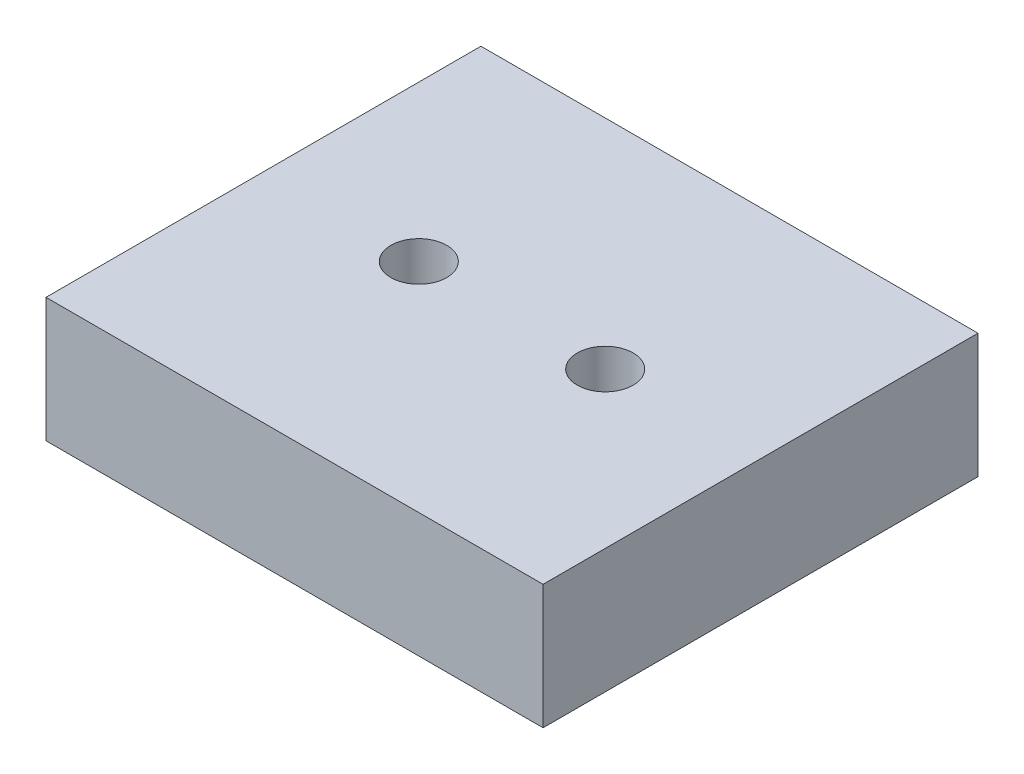
ISO-10303-21;
HEADER;
FILE_DESCRIPTION(('STEP AP214'),'2;1');
FILE_NAME('part.step','',(''),(''),'','','');
FILE_SCHEMA(('AUTOMOTIVE_DESIGN { 1 0 10303 214 1 1 1 1 }'));
ENDSEC;
DATA;
#1=APPLICATION_CONTEXT('core data for automotive mechanical design processes');
#2=APPLICATION_PROTOCOL_DEFINITION('international standard','automotive_design',2000,#1);
#3=PRODUCT_CONTEXT('',#1,'mechanical');
#4=PRODUCT('Part','Part','',(#3));
#5=PRODUCT_RELATED_PRODUCT_CATEGORY('part','',(#4));
#6=PRODUCT_DEFINITION_FORMATION('','',#4);
#7=PRODUCT_DEFINITION_CONTEXT('part definition',#1,'design');
#8=PRODUCT_DEFINITION('design','',#6,#7);
#9=PRODUCT_DEFINITION_SHAPE('','',#8);
#10=(LENGTH_UNIT() NAMED_UNIT(*) SI_UNIT(.MILLI.,.METRE.));
#11=(NAMED_UNIT(*) PLANE_ANGLE_UNIT() SI_UNIT($,.RADIAN.));
#12=(NAMED_UNIT(*) SI_UNIT($,.STERADIAN.) SOLID_ANGLE_UNIT());
#13=UNCERTAINTY_MEASURE_WITH_UNIT(LENGTH_MEASURE(1.E-05),#10,'distance_accuracy_value','');
#14=(GEOMETRIC_REPRESENTATION_CONTEXT(3) GLOBAL_UNCERTAINTY_ASSIGNED_CONTEXT((#13)) GLOBAL_UNIT_ASSIGNED_CONTEXT((#10,
#11,#12)) REPRESENTATION_CONTEXT('',''));
#15=CARTESIAN_POINT('',(0.,0.,0.));
#16=DIRECTION('',(0.,0.,1.));
#17=DIRECTION('',(1.,0.,0.));
#18=AXIS2_PLACEMENT_3D('',#15,#16,#17);
#19=CARTESIAN_POINT('',(20.,10.,-17.5));
#20=DIRECTION('',(-1.,0.,0.));
#21=DIRECTION('',(0.,0.,1.));
#22=AXIS2_PLACEMENT_3D('',#19,#20,#21);
#23=PLANE('',#22);
#24=DIRECTION('',(0.,0.,-1.));
#25=VECTOR('',#24,1.);
#26=CARTESIAN_POINT('',(20.,0.,-17.5));
#27=LINE('',#26,#25);
#28=CARTESIAN_POINT('',(20.,0.,17.5));
#29=VERTEX_POINT('',#28);
#30=CARTESIAN_POINT('',(20.,0.,-17.5));
#31=VERTEX_POINT('',#30);
#32=EDGE_CURVE('E155',#29,#31,#27,.T.);
#33=ORIENTED_EDGE('',*,*,#32,.T.);
#34=DIRECTION('',(0.,-1.,0.));
#35=VECTOR('',#34,1.);
#36=CARTESIAN_POINT('',(20.,10.,-17.5));
#37=LINE('',#36,#35);
#38=CARTESIAN_POINT('',(20.,10.,-17.5));
#39=VERTEX_POINT('',#38);
#40=EDGE_CURVE('E12',#39,#31,#37,.T.);
#41=ORIENTED_EDGE('',*,*,#40,.F.);
#42=DIRECTION('',(0.,0.,-1.));
#43=VECTOR('',#42,1.);
#44=CARTESIAN_POINT('',(20.,10.,-17.5));
#45=LINE('',#44,#43);
#46=CARTESIAN_POINT('',(20.,10.,17.5));
#47=VERTEX_POINT('',#46);
#48=EDGE_CURVE('E138',#47,#39,#45,.T.);
#49=ORIENTED_EDGE('',*,*,#48,.F.);
#50=DIRECTION('',(0.,-1.,0.));
#51=VECTOR('',#50,1.);
#52=CARTESIAN_POINT('',(20.,10.,17.5));
#53=LINE('',#52,#51);
#54=EDGE_CURVE('E146',#47,#29,#53,.T.);
#55=ORIENTED_EDGE('',*,*,#54,.T.);
#56=EDGE_LOOP('',(#33,#41,#49,#55));
#57=FACE_BOUND('',#56,.T.);
#58=ADVANCED_FACE('F90',(#57),#23,.F.);
#59=CARTESIAN_POINT('',(-20.,10.,-17.5));
#60=DIRECTION('',(0.,0.,1.));
#61=DIRECTION('',(1.,0.,0.));
#62=AXIS2_PLACEMENT_3D('',#59,#60,#61);
#63=PLANE('',#62);
#64=DIRECTION('',(-1.,0.,0.));
#65=VECTOR('',#64,1.);
#66=CARTESIAN_POINT('',(-20.,0.,-17.5));
#67=LINE('',#66,#65);
#68=CARTESIAN_POINT('',(-20.,0.,-17.5));
#69=VERTEX_POINT('',#68);
#70=EDGE_CURVE('E145',#31,#69,#67,.T.);
#71=ORIENTED_EDGE('',*,*,#70,.T.);
#72=DIRECTION('',(0.,-1.,0.));
#73=VECTOR('',#72,1.);
#74=CARTESIAN_POINT('',(-20.,10.,-17.5));
#75=LINE('',#74,#73);
#76=CARTESIAN_POINT('',(-20.,10.,-17.5));
#77=VERTEX_POINT('',#76);
#78=EDGE_CURVE('E100',#77,#69,#75,.T.);
#79=ORIENTED_EDGE('',*,*,#78,.F.);
#80=DIRECTION('',(-1.,0.,0.));
#81=VECTOR('',#80,1.);
#82=CARTESIAN_POINT('',(-20.,10.,-17.5));
#83=LINE('',#82,#81);
#84=EDGE_CURVE('E133',#39,#77,#83,.T.);
#85=ORIENTED_EDGE('',*,*,#84,.F.);
#86=ORIENTED_EDGE('',*,*,#40,.T.);
#87=EDGE_LOOP('',(#71,#79,#85,#86));
#88=FACE_BOUND('',#87,.T.);
#89=ADVANCED_FACE('F141',(#88),#63,.F.);
#90=CARTESIAN_POINT('',(-20.,10.,-17.5));
#91=DIRECTION('',(1.,0.,0.));
#92=DIRECTION('',(0.,0.,-1.));
#93=AXIS2_PLACEMENT_3D('',#90,#91,#92);
#94=PLANE('',#93);
#95=DIRECTION('',(0.,0.,1.));
#96=VECTOR('',#95,1.);
#97=CARTESIAN_POINT('',(-20.,0.,-17.5));
#98=LINE('',#97,#96);
#99=CARTESIAN_POINT('',(-20.,0.,17.5));
#100=VERTEX_POINT('',#99);
#101=EDGE_CURVE('E125',#69,#100,#98,.T.);
#102=ORIENTED_EDGE('',*,*,#101,.T.);
#103=DIRECTION('',(0.,-1.,0.));
#104=VECTOR('',#103,1.);
#105=CARTESIAN_POINT('',(-20.,10.,17.5));
#106=LINE('',#105,#104);
#107=CARTESIAN_POINT('',(-20.,10.,17.5));
#108=VERTEX_POINT('',#107);
#109=EDGE_CURVE('E144',#108,#100,#106,.T.);
#110=ORIENTED_EDGE('',*,*,#109,.F.);
#111=DIRECTION('',(0.,0.,1.));
#112=VECTOR('',#111,1.);
#113=CARTESIAN_POINT('',(-20.,10.,-17.5));
#114=LINE('',#113,#112);
#115=EDGE_CURVE('E139',#77,#108,#114,.T.);
#116=ORIENTED_EDGE('',*,*,#115,.F.);
#117=ORIENTED_EDGE('',*,*,#78,.T.);
#118=EDGE_LOOP('',(#102,#110,#116,#117));
#119=FACE_BOUND('',#118,.T.);
#120=ADVANCED_FACE('F148',(#119),#94,.F.);
#121=CARTESIAN_POINT('',(-20.,10.,17.5));
#122=DIRECTION('',(0.,0.,-1.));
#123=DIRECTION('',(-1.,0.,0.));
#124=AXIS2_PLACEMENT_3D('',#121,#122,#123);
#125=PLANE('',#124);
#126=DIRECTION('',(1.,0.,0.));
#127=VECTOR('',#126,1.);
#128=CARTESIAN_POINT('',(-20.,0.,17.5));
#129=LINE('',#128,#127);
#130=EDGE_CURVE('E126',#100,#29,#129,.T.);
#131=ORIENTED_EDGE('',*,*,#130,.T.);
#132=ORIENTED_EDGE('',*,*,#54,.F.);
#133=DIRECTION('',(1.,0.,0.));
#134=VECTOR('',#133,1.);
#135=CARTESIAN_POINT('',(-20.,10.,17.5));
#136=LINE('',#135,#134);
#137=EDGE_CURVE('E104',#108,#47,#136,.T.);
#138=ORIENTED_EDGE('',*,*,#137,.F.);
#139=ORIENTED_EDGE('',*,*,#109,.T.);
#140=EDGE_LOOP('',(#131,#132,#138,#139));
#141=FACE_BOUND('',#140,.T.);
#142=ADVANCED_FACE('F159',(#141),#125,.F.);
#143=CARTESIAN_POINT('',(0.,10.,0.));
#144=DIRECTION('',(0.,1.,0.));
#145=DIRECTION('',(0.,0.,1.));
#146=AXIS2_PLACEMENT_3D('',#143,#144,#145);
#147=PLANE('',#146);
#148=CARTESIAN_POINT('',(-7.5,10.,0.));
#149=DIRECTION('',(0.,1.,0.));
#150=DIRECTION('',(0.,0.,1.));
#151=AXIS2_PLACEMENT_3D('',#148,#149,#150);
#152=CIRCLE('',#151,2.25);
#153=CARTESIAN_POINT('',(-7.5,10.,2.25));
#154=VERTEX_POINT('',#153);
#155=EDGE_CURVE('E154',#154,#154,#152,.T.);
#156=ORIENTED_EDGE('',*,*,#155,.F.);
#157=EDGE_LOOP('',(#156));
#158=FACE_BOUND('',#157,.T.);
#159=CARTESIAN_POINT('',(7.5,10.,0.));
#160=DIRECTION('',(0.,1.,0.));
#161=DIRECTION('',(0.,0.,1.));
#162=AXIS2_PLACEMENT_3D('',#159,#160,#161);
#163=CIRCLE('',#162,2.25);
#164=CARTESIAN_POINT('',(7.5,10.,2.25));
#165=VERTEX_POINT('',#164);
#166=EDGE_CURVE('E166',#165,#165,#163,.T.);
#167=ORIENTED_EDGE('',*,*,#166,.F.);
#168=EDGE_LOOP('',(#167));
#169=FACE_BOUND('',#168,.T.);
#170=ORIENTED_EDGE('',*,*,#48,.T.);
#171=ORIENTED_EDGE('',*,*,#84,.T.);
#172=ORIENTED_EDGE('',*,*,#115,.T.);
#173=ORIENTED_EDGE('',*,*,#137,.T.);
#174=EDGE_LOOP('',(#170,#171,#172,#173));
#175=FACE_BOUND('',#174,.T.);
#176=ADVANCED_FACE('F137',(#158,#169,#175),#147,.T.);
#177=CARTESIAN_POINT('',(0.,0.,0.));
#178=DIRECTION('',(0.,1.,0.));
#179=DIRECTION('',(0.,0.,1.));
#180=AXIS2_PLACEMENT_3D('',#177,#178,#179);
#181=PLANE('',#180);
#182=CARTESIAN_POINT('',(-7.5,0.,0.));
#183=DIRECTION('',(0.,1.,0.));
#184=DIRECTION('',(0.,0.,1.));
#185=AXIS2_PLACEMENT_3D('',#182,#183,#184);
#186=CIRCLE('',#185,5.);
#187=CARTESIAN_POINT('',(-7.5,0.,5.));
#188=VERTEX_POINT('',#187);
#189=EDGE_CURVE('E182',#188,#188,#186,.T.);
#190=ORIENTED_EDGE('',*,*,#189,.T.);
#191=EDGE_LOOP('',(#190));
#192=FACE_BOUND('',#191,.T.);
#193=CARTESIAN_POINT('',(7.5,0.,0.));
#194=DIRECTION('',(0.,1.,0.));
#195=DIRECTION('',(0.,0.,1.));
#196=AXIS2_PLACEMENT_3D('',#193,#194,#195);
#197=CIRCLE('',#196,5.);
#198=CARTESIAN_POINT('',(7.5,0.,5.));
#199=VERTEX_POINT('',#198);
#200=EDGE_CURVE('E185',#199,#199,#197,.T.);
#201=ORIENTED_EDGE('',*,*,#200,.T.);
#202=EDGE_LOOP('',(#201));
#203=FACE_BOUND('',#202,.T.);
#204=ORIENTED_EDGE('',*,*,#32,.F.);
#205=ORIENTED_EDGE('',*,*,#130,.F.);
#206=ORIENTED_EDGE('',*,*,#101,.F.);
#207=ORIENTED_EDGE('',*,*,#70,.F.);
#208=EDGE_LOOP('',(#204,#205,#206,#207));
#209=FACE_BOUND('',#208,.T.);
#210=ADVANCED_FACE('F162',(#192,#203,#209),#181,.F.);
#211=CARTESIAN_POINT('',(7.5,10.,0.));
#212=DIRECTION('',(0.,-1.,0.));
#213=DIRECTION('',(0.,0.,-1.));
#214=AXIS2_PLACEMENT_3D('',#211,#212,#213);
#215=CYLINDRICAL_SURFACE('',#214,2.25);
#216=ORIENTED_EDGE('',*,*,#166,.T.);
#217=EDGE_LOOP('',(#216));
#218=FACE_BOUND('',#217,.T.);
#219=CARTESIAN_POINT('',(7.5,5.,0.));
#220=DIRECTION('',(0.,1.,0.));
#221=DIRECTION('',(0.,0.,1.));
#222=AXIS2_PLACEMENT_3D('',#219,#220,#221);
#223=CIRCLE('',#222,2.25);
#224=CARTESIAN_POINT('',(7.5,5.,2.25));
#225=VERTEX_POINT('',#224);
#226=EDGE_CURVE('E167',#225,#225,#223,.T.);
#227=ORIENTED_EDGE('',*,*,#226,.F.);
#228=EDGE_LOOP('',(#227));
#229=FACE_BOUND('',#228,.T.);
#230=ADVANCED_FACE('F224',(#218,#229),#215,.F.);
#231=CARTESIAN_POINT('',(-7.5,10.,0.));
#232=DIRECTION('',(0.,-1.,0.));
#233=DIRECTION('',(0.,0.,-1.));
#234=AXIS2_PLACEMENT_3D('',#231,#232,#233);
#235=CYLINDRICAL_SURFACE('',#234,2.25);
#236=ORIENTED_EDGE('',*,*,#155,.T.);
#237=EDGE_LOOP('',(#236));
#238=FACE_BOUND('',#237,.T.);
#239=CARTESIAN_POINT('',(-7.5,5.,0.));
#240=DIRECTION('',(0.,1.,0.));
#241=DIRECTION('',(0.,0.,1.));
#242=AXIS2_PLACEMENT_3D('',#239,#240,#241);
#243=CIRCLE('',#242,2.25);
#244=CARTESIAN_POINT('',(-7.5,5.,2.25));
#245=VERTEX_POINT('',#244);
#246=EDGE_CURVE('E168',#245,#245,#243,.T.);
#247=ORIENTED_EDGE('',*,*,#246,.F.);
#248=EDGE_LOOP('',(#247));
#249=FACE_BOUND('',#248,.T.);
#250=ADVANCED_FACE('F207',(#238,#249),#235,.F.);
#251=CARTESIAN_POINT('',(0.,5.,0.));
#252=DIRECTION('',(0.,1.,0.));
#253=DIRECTION('',(0.,0.,1.));
#254=AXIS2_PLACEMENT_3D('',#251,#252,#253);
#255=PLANE('',#254);
#256=ORIENTED_EDGE('',*,*,#226,.T.);
#257=EDGE_LOOP('',(#256));
#258=FACE_BOUND('',#257,.T.);
#259=CARTESIAN_POINT('',(7.5,5.,0.));
#260=DIRECTION('',(0.,1.,0.));
#261=DIRECTION('',(0.,0.,1.));
#262=AXIS2_PLACEMENT_3D('',#259,#260,#261);
#263=CIRCLE('',#262,5.);
#264=CARTESIAN_POINT('',(7.5,5.,5.));
#265=VERTEX_POINT('',#264);
#266=EDGE_CURVE('E179',#265,#265,#263,.T.);
#267=ORIENTED_EDGE('',*,*,#266,.F.);
#268=EDGE_LOOP('',(#267));
#269=FACE_BOUND('',#268,.T.);
#270=ADVANCED_FACE('F197',(#258,#269),#255,.F.);
#271=CARTESIAN_POINT('',(7.5,0.,0.));
#272=DIRECTION('',(0.,1.,0.));
#273=DIRECTION('',(0.,0.,1.));
#274=AXIS2_PLACEMENT_3D('',#271,#272,#273);
#275=CYLINDRICAL_SURFACE('',#274,5.);
#276=ORIENTED_EDGE('',*,*,#200,.F.);
#277=EDGE_LOOP('',(#276));
#278=FACE_BOUND('',#277,.T.);
#279=ORIENTED_EDGE('',*,*,#266,.T.);
#280=EDGE_LOOP('',(#279));
#281=FACE_BOUND('',#280,.T.);
#282=ADVANCED_FACE('F203',(#278,#281),#275,.F.);
#283=CARTESIAN_POINT('',(0.,5.,0.));
#284=DIRECTION('',(0.,1.,0.));
#285=DIRECTION('',(0.,0.,1.));
#286=AXIS2_PLACEMENT_3D('',#283,#284,#285);
#287=PLANE('',#286);
#288=ORIENTED_EDGE('',*,*,#246,.T.);
#289=EDGE_LOOP('',(#288));
#290=FACE_BOUND('',#289,.T.);
#291=CARTESIAN_POINT('',(-7.5,5.,0.));
#292=DIRECTION('',(0.,1.,0.));
#293=DIRECTION('',(0.,0.,1.));
#294=AXIS2_PLACEMENT_3D('',#291,#292,#293);
#295=CIRCLE('',#294,5.);
#296=CARTESIAN_POINT('',(-7.5,5.,5.));
#297=VERTEX_POINT('',#296);
#298=EDGE_CURVE('E173',#297,#297,#295,.T.);
#299=ORIENTED_EDGE('',*,*,#298,.F.);
#300=EDGE_LOOP('',(#299));
#301=FACE_BOUND('',#300,.T.);
#302=ADVANCED_FACE('F193',(#290,#301),#287,.F.);
#303=CARTESIAN_POINT('',(-7.5,0.,0.));
#304=DIRECTION('',(0.,1.,0.));
#305=DIRECTION('',(0.,0.,1.));
#306=AXIS2_PLACEMENT_3D('',#303,#304,#305);
#307=CYLINDRICAL_SURFACE('',#306,5.);
#308=ORIENTED_EDGE('',*,*,#189,.F.);
#309=EDGE_LOOP('',(#308));
#310=FACE_BOUND('',#309,.T.);
#311=ORIENTED_EDGE('',*,*,#298,.T.);
#312=EDGE_LOOP('',(#311));
#313=FACE_BOUND('',#312,.T.);
#314=ADVANCED_FACE('F195',(#310,#313),#307,.F.);
#315=CLOSED_SHELL('',(#58,#89,#120,#142,#176,#210,#230,#250,#270,#282,#302,#314));
#316=MANIFOLD_SOLID_BREP('B2',#315);
#317=ADVANCED_BREP_SHAPE_REPRESENTATION('',(#18,#316),#14);
#318=SHAPE_DEFINITION_REPRESENTATION(#9,#317);
ENDSEC;
END-ISO-10303-21;
